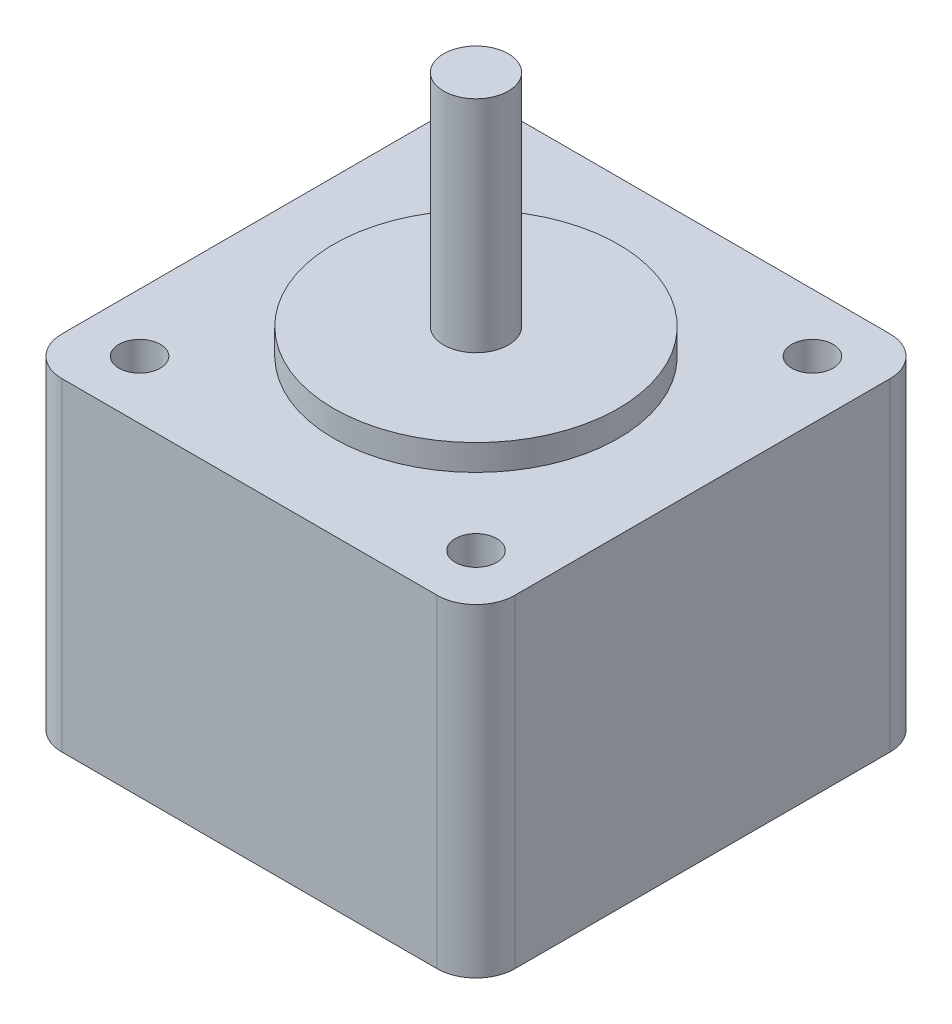
ISO-10303-21;
HEADER;
FILE_DESCRIPTION(('STEP AP214'),'2;1');
FILE_NAME('part.step','',(''),(''),'','','');
FILE_SCHEMA(('AUTOMOTIVE_DESIGN { 1 0 10303 214 1 1 1 1 }'));
ENDSEC;
DATA;
#1=APPLICATION_CONTEXT('core data for automotive mechanical design processes');
#2=APPLICATION_PROTOCOL_DEFINITION('international standard','automotive_design',2000,#1);
#3=PRODUCT_CONTEXT('',#1,'mechanical');
#4=PRODUCT('Part','Part','',(#3));
#5=PRODUCT_RELATED_PRODUCT_CATEGORY('part','',(#4));
#6=PRODUCT_DEFINITION_FORMATION('','',#4);
#7=PRODUCT_DEFINITION_CONTEXT('part definition',#1,'design');
#8=PRODUCT_DEFINITION('design','',#6,#7);
#9=PRODUCT_DEFINITION_SHAPE('','',#8);
#10=(LENGTH_UNIT() NAMED_UNIT(*) SI_UNIT(.MILLI.,.METRE.));
#11=(NAMED_UNIT(*) PLANE_ANGLE_UNIT() SI_UNIT($,.RADIAN.));
#12=(NAMED_UNIT(*) SI_UNIT($,.STERADIAN.) SOLID_ANGLE_UNIT());
#13=UNCERTAINTY_MEASURE_WITH_UNIT(LENGTH_MEASURE(1.E-05),#10,'distance_accuracy_value','');
#14=(GEOMETRIC_REPRESENTATION_CONTEXT(3) GLOBAL_UNCERTAINTY_ASSIGNED_CONTEXT((#13)) GLOBAL_UNIT_ASSIGNED_CONTEXT((#10,
#11,#12)) REPRESENTATION_CONTEXT('',''));
#15=CARTESIAN_POINT('',(0.,0.,0.));
#16=DIRECTION('',(0.,0.,1.));
#17=DIRECTION('',(1.,0.,0.));
#18=AXIS2_PLACEMENT_3D('',#15,#16,#17);
#19=CARTESIAN_POINT('',(-14.5,25.,14.5));
#20=DIRECTION('',(0.,-1.,0.));
#21=DIRECTION('',(0.,0.,-1.));
#22=AXIS2_PLACEMENT_3D('',#19,#20,#21);
#23=CYLINDRICAL_SURFACE('',#22,3.);
#24=CARTESIAN_POINT('',(-14.5,0.,14.5));
#25=DIRECTION('',(0.,1.,0.));
#26=DIRECTION('',(0.,0.,1.));
#27=AXIS2_PLACEMENT_3D('',#24,#25,#26);
#28=CIRCLE('',#27,3.);
#29=CARTESIAN_POINT('',(-17.5,0.,14.5));
#30=VERTEX_POINT('',#29);
#31=CARTESIAN_POINT('',(-14.5,0.,17.5));
#32=VERTEX_POINT('',#31);
#33=EDGE_CURVE('E143',#30,#32,#28,.T.);
#34=ORIENTED_EDGE('',*,*,#33,.T.);
#35=DIRECTION('',(0.,-1.,0.));
#36=VECTOR('',#35,1.);
#37=CARTESIAN_POINT('',(-14.5,25.,17.5));
#38=LINE('',#37,#36);
#39=CARTESIAN_POINT('',(-14.5,25.,17.5));
#40=VERTEX_POINT('',#39);
#41=EDGE_CURVE('E42',#40,#32,#38,.T.);
#42=ORIENTED_EDGE('',*,*,#41,.F.);
#43=CARTESIAN_POINT('',(-14.5,25.,14.5));
#44=DIRECTION('',(0.,1.,0.));
#45=DIRECTION('',(0.,0.,1.));
#46=AXIS2_PLACEMENT_3D('',#43,#44,#45);
#47=CIRCLE('',#46,3.);
#48=CARTESIAN_POINT('',(-17.5,25.,14.5));
#49=VERTEX_POINT('',#48);
#50=EDGE_CURVE('E166',#49,#40,#47,.T.);
#51=ORIENTED_EDGE('',*,*,#50,.F.);
#52=DIRECTION('',(0.,-1.,0.));
#53=VECTOR('',#52,1.);
#54=CARTESIAN_POINT('',(-17.5,25.,14.5));
#55=LINE('',#54,#53);
#56=EDGE_CURVE('E139',#49,#30,#55,.T.);
#57=ORIENTED_EDGE('',*,*,#56,.T.);
#58=EDGE_LOOP('',(#34,#42,#51,#57));
#59=FACE_BOUND('',#58,.T.);
#60=ADVANCED_FACE('F39',(#59),#23,.T.);
#61=CARTESIAN_POINT('',(-14.5,25.,17.5));
#62=DIRECTION('',(0.,0.,-1.));
#63=DIRECTION('',(-1.,0.,0.));
#64=AXIS2_PLACEMENT_3D('',#61,#62,#63);
#65=PLANE('',#64);
#66=DIRECTION('',(1.,0.,0.));
#67=VECTOR('',#66,1.);
#68=CARTESIAN_POINT('',(-14.5,0.,17.5));
#69=LINE('',#68,#67);
#70=CARTESIAN_POINT('',(14.5,0.,17.5));
#71=VERTEX_POINT('',#70);
#72=EDGE_CURVE('E147',#32,#71,#69,.T.);
#73=ORIENTED_EDGE('',*,*,#72,.T.);
#74=DIRECTION('',(0.,-1.,0.));
#75=VECTOR('',#74,1.);
#76=CARTESIAN_POINT('',(14.5,25.,17.5));
#77=LINE('',#76,#75);
#78=CARTESIAN_POINT('',(14.5,25.,17.5));
#79=VERTEX_POINT('',#78);
#80=EDGE_CURVE('E180',#79,#71,#77,.T.);
#81=ORIENTED_EDGE('',*,*,#80,.F.);
#82=DIRECTION('',(1.,0.,0.));
#83=VECTOR('',#82,1.);
#84=CARTESIAN_POINT('',(-14.5,25.,17.5));
#85=LINE('',#84,#83);
#86=EDGE_CURVE('E102',#40,#79,#85,.T.);
#87=ORIENTED_EDGE('',*,*,#86,.F.);
#88=ORIENTED_EDGE('',*,*,#41,.T.);
#89=EDGE_LOOP('',(#73,#81,#87,#88));
#90=FACE_BOUND('',#89,.T.);
#91=ADVANCED_FACE('F277',(#90),#65,.F.);
#92=CARTESIAN_POINT('',(14.5,25.,14.5));
#93=DIRECTION('',(0.,-1.,0.));
#94=DIRECTION('',(0.,0.,-1.));
#95=AXIS2_PLACEMENT_3D('',#92,#93,#94);
#96=CYLINDRICAL_SURFACE('',#95,3.);
#97=CARTESIAN_POINT('',(14.5,0.,14.5));
#98=DIRECTION('',(0.,1.,0.));
#99=DIRECTION('',(0.,0.,1.));
#100=AXIS2_PLACEMENT_3D('',#97,#98,#99);
#101=CIRCLE('',#100,3.);
#102=CARTESIAN_POINT('',(17.5,0.,14.5));
#103=VERTEX_POINT('',#102);
#104=EDGE_CURVE('E151',#71,#103,#101,.T.);
#105=ORIENTED_EDGE('',*,*,#104,.T.);
#106=DIRECTION('',(0.,-1.,0.));
#107=VECTOR('',#106,1.);
#108=CARTESIAN_POINT('',(17.5,25.,14.5));
#109=LINE('',#108,#107);
#110=CARTESIAN_POINT('',(17.5,25.,14.5));
#111=VERTEX_POINT('',#110);
#112=EDGE_CURVE('E177',#111,#103,#109,.T.);
#113=ORIENTED_EDGE('',*,*,#112,.F.);
#114=CARTESIAN_POINT('',(14.5,25.,14.5));
#115=DIRECTION('',(0.,1.,0.));
#116=DIRECTION('',(0.,0.,1.));
#117=AXIS2_PLACEMENT_3D('',#114,#115,#116);
#118=CIRCLE('',#117,3.);
#119=EDGE_CURVE('E199',#79,#111,#118,.T.);
#120=ORIENTED_EDGE('',*,*,#119,.F.);
#121=ORIENTED_EDGE('',*,*,#80,.T.);
#122=EDGE_LOOP('',(#105,#113,#120,#121));
#123=FACE_BOUND('',#122,.T.);
#124=ADVANCED_FACE('F282',(#123),#96,.T.);
#125=CARTESIAN_POINT('',(17.5,25.,-14.5));
#126=DIRECTION('',(-1.,0.,0.));
#127=DIRECTION('',(0.,0.,1.));
#128=AXIS2_PLACEMENT_3D('',#125,#126,#127);
#129=PLANE('',#128);
#130=DIRECTION('',(0.,0.,-1.));
#131=VECTOR('',#130,1.);
#132=CARTESIAN_POINT('',(17.5,0.,-14.5));
#133=LINE('',#132,#131);
#134=CARTESIAN_POINT('',(17.5,0.,-14.5));
#135=VERTEX_POINT('',#134);
#136=EDGE_CURVE('E154',#103,#135,#133,.T.);
#137=ORIENTED_EDGE('',*,*,#136,.T.);
#138=DIRECTION('',(0.,-1.,0.));
#139=VECTOR('',#138,1.);
#140=CARTESIAN_POINT('',(17.5,25.,-14.5));
#141=LINE('',#140,#139);
#142=CARTESIAN_POINT('',(17.5,25.,-14.5));
#143=VERTEX_POINT('',#142);
#144=EDGE_CURVE('E173',#143,#135,#141,.T.);
#145=ORIENTED_EDGE('',*,*,#144,.F.);
#146=DIRECTION('',(0.,0.,-1.));
#147=VECTOR('',#146,1.);
#148=CARTESIAN_POINT('',(17.5,25.,-14.5));
#149=LINE('',#148,#147);
#150=EDGE_CURVE('E202',#111,#143,#149,.T.);
#151=ORIENTED_EDGE('',*,*,#150,.F.);
#152=ORIENTED_EDGE('',*,*,#112,.T.);
#153=EDGE_LOOP('',(#137,#145,#151,#152));
#154=FACE_BOUND('',#153,.T.);
#155=ADVANCED_FACE('F291',(#154),#129,.F.);
#156=CARTESIAN_POINT('',(14.5,25.,-14.5));
#157=DIRECTION('',(0.,-1.,0.));
#158=DIRECTION('',(0.,0.,-1.));
#159=AXIS2_PLACEMENT_3D('',#156,#157,#158);
#160=CYLINDRICAL_SURFACE('',#159,3.);
#161=CARTESIAN_POINT('',(14.5,0.,-14.5));
#162=DIRECTION('',(0.,1.,0.));
#163=DIRECTION('',(0.,0.,1.));
#164=AXIS2_PLACEMENT_3D('',#161,#162,#163);
#165=CIRCLE('',#164,3.);
#166=CARTESIAN_POINT('',(14.5,0.,-17.5));
#167=VERTEX_POINT('',#166);
#168=EDGE_CURVE('E157',#135,#167,#165,.T.);
#169=ORIENTED_EDGE('',*,*,#168,.T.);
#170=DIRECTION('',(0.,-1.,0.));
#171=VECTOR('',#170,1.);
#172=CARTESIAN_POINT('',(14.5,25.,-17.5));
#173=LINE('',#172,#171);
#174=CARTESIAN_POINT('',(14.5,25.,-17.5));
#175=VERTEX_POINT('',#174);
#176=EDGE_CURVE('E132',#175,#167,#173,.T.);
#177=ORIENTED_EDGE('',*,*,#176,.F.);
#178=CARTESIAN_POINT('',(14.5,25.,-14.5));
#179=DIRECTION('',(0.,1.,0.));
#180=DIRECTION('',(0.,0.,1.));
#181=AXIS2_PLACEMENT_3D('',#178,#179,#180);
#182=CIRCLE('',#181,3.);
#183=EDGE_CURVE('E121',#143,#175,#182,.T.);
#184=ORIENTED_EDGE('',*,*,#183,.F.);
#185=ORIENTED_EDGE('',*,*,#144,.T.);
#186=EDGE_LOOP('',(#169,#177,#184,#185));
#187=FACE_BOUND('',#186,.T.);
#188=ADVANCED_FACE('F294',(#187),#160,.T.);
#189=CARTESIAN_POINT('',(-14.5,25.,-17.5));
#190=DIRECTION('',(0.,0.,1.));
#191=DIRECTION('',(1.,0.,0.));
#192=AXIS2_PLACEMENT_3D('',#189,#190,#191);
#193=PLANE('',#192);
#194=DIRECTION('',(-1.,0.,0.));
#195=VECTOR('',#194,1.);
#196=CARTESIAN_POINT('',(-14.5,0.,-17.5));
#197=LINE('',#196,#195);
#198=CARTESIAN_POINT('',(-14.5,0.,-17.5));
#199=VERTEX_POINT('',#198);
#200=EDGE_CURVE('E130',#167,#199,#197,.T.);
#201=ORIENTED_EDGE('',*,*,#200,.T.);
#202=DIRECTION('',(0.,-1.,0.));
#203=VECTOR('',#202,1.);
#204=CARTESIAN_POINT('',(-14.5,25.,-17.5));
#205=LINE('',#204,#203);
#206=CARTESIAN_POINT('',(-14.5,25.,-17.5));
#207=VERTEX_POINT('',#206);
#208=EDGE_CURVE('E127',#207,#199,#205,.T.);
#209=ORIENTED_EDGE('',*,*,#208,.F.);
#210=DIRECTION('',(-1.,0.,0.));
#211=VECTOR('',#210,1.);
#212=CARTESIAN_POINT('',(-14.5,25.,-17.5));
#213=LINE('',#212,#211);
#214=EDGE_CURVE('E115',#175,#207,#213,.T.);
#215=ORIENTED_EDGE('',*,*,#214,.F.);
#216=ORIENTED_EDGE('',*,*,#176,.T.);
#217=EDGE_LOOP('',(#201,#209,#215,#216));
#218=FACE_BOUND('',#217,.T.);
#219=ADVANCED_FACE('F128',(#218),#193,.F.);
#220=CARTESIAN_POINT('',(-14.5,25.,-14.5));
#221=DIRECTION('',(0.,-1.,0.));
#222=DIRECTION('',(0.,0.,-1.));
#223=AXIS2_PLACEMENT_3D('',#220,#221,#222);
#224=CYLINDRICAL_SURFACE('',#223,3.);
#225=CARTESIAN_POINT('',(-14.5,0.,-14.5));
#226=DIRECTION('',(0.,1.,0.));
#227=DIRECTION('',(0.,0.,-1.));
#228=AXIS2_PLACEMENT_3D('',#225,#226,#227);
#229=CIRCLE('',#228,3.);
#230=CARTESIAN_POINT('',(-17.5,0.,-14.5));
#231=VERTEX_POINT('',#230);
#232=EDGE_CURVE('E87',#199,#231,#229,.T.);
#233=ORIENTED_EDGE('',*,*,#232,.T.);
#234=DIRECTION('',(0.,-1.,0.));
#235=VECTOR('',#234,1.);
#236=CARTESIAN_POINT('',(-17.5,25.,-14.5));
#237=LINE('',#236,#235);
#238=CARTESIAN_POINT('',(-17.5,25.,-14.5));
#239=VERTEX_POINT('',#238);
#240=EDGE_CURVE('E133',#239,#231,#237,.T.);
#241=ORIENTED_EDGE('',*,*,#240,.F.);
#242=CARTESIAN_POINT('',(-14.5,25.,-14.5));
#243=DIRECTION('',(0.,1.,0.));
#244=DIRECTION('',(0.,0.,-1.));
#245=AXIS2_PLACEMENT_3D('',#242,#243,#244);
#246=CIRCLE('',#245,3.);
#247=EDGE_CURVE('E119',#207,#239,#246,.T.);
#248=ORIENTED_EDGE('',*,*,#247,.F.);
#249=ORIENTED_EDGE('',*,*,#208,.T.);
#250=EDGE_LOOP('',(#233,#241,#248,#249));
#251=FACE_BOUND('',#250,.T.);
#252=ADVANCED_FACE('F135',(#251),#224,.T.);
#253=CARTESIAN_POINT('',(-17.5,25.,-14.5));
#254=DIRECTION('',(1.,0.,0.));
#255=DIRECTION('',(0.,0.,-1.));
#256=AXIS2_PLACEMENT_3D('',#253,#254,#255);
#257=PLANE('',#256);
#258=DIRECTION('',(0.,0.,1.));
#259=VECTOR('',#258,1.);
#260=CARTESIAN_POINT('',(-17.5,0.,-14.5));
#261=LINE('',#260,#259);
#262=EDGE_CURVE('E93',#231,#30,#261,.T.);
#263=ORIENTED_EDGE('',*,*,#262,.T.);
#264=ORIENTED_EDGE('',*,*,#56,.F.);
#265=DIRECTION('',(0.,0.,1.));
#266=VECTOR('',#265,1.);
#267=CARTESIAN_POINT('',(-17.5,25.,-14.5));
#268=LINE('',#267,#266);
#269=EDGE_CURVE('E58',#239,#49,#268,.T.);
#270=ORIENTED_EDGE('',*,*,#269,.F.);
#271=ORIENTED_EDGE('',*,*,#240,.T.);
#272=EDGE_LOOP('',(#263,#264,#270,#271));
#273=FACE_BOUND('',#272,.T.);
#274=ADVANCED_FACE('F250',(#273),#257,.F.);
#275=CARTESIAN_POINT('',(-14.5,25.,14.5));
#276=DIRECTION('',(0.,1.,0.));
#277=DIRECTION('',(0.,0.,1.));
#278=AXIS2_PLACEMENT_3D('',#275,#276,#277);
#279=PLANE('',#278);
#280=CARTESIAN_POINT('',(-13.,25.,13.));
#281=DIRECTION('',(0.,1.,0.));
#282=DIRECTION('',(0.,0.,1.));
#283=AXIS2_PLACEMENT_3D('',#280,#281,#282);
#284=CIRCLE('',#283,1.6);
#285=CARTESIAN_POINT('',(-13.,25.,14.6));
#286=VERTEX_POINT('',#285);
#287=EDGE_CURVE('E239',#286,#286,#284,.T.);
#288=ORIENTED_EDGE('',*,*,#287,.F.);
#289=EDGE_LOOP('',(#288));
#290=FACE_BOUND('',#289,.T.);
#291=CARTESIAN_POINT('',(13.,25.,13.));
#292=DIRECTION('',(0.,1.,0.));
#293=DIRECTION('',(0.,0.,1.));
#294=AXIS2_PLACEMENT_3D('',#291,#292,#293);
#295=CIRCLE('',#294,1.6);
#296=CARTESIAN_POINT('',(13.,25.,14.6));
#297=VERTEX_POINT('',#296);
#298=EDGE_CURVE('E231',#297,#297,#295,.T.);
#299=ORIENTED_EDGE('',*,*,#298,.F.);
#300=EDGE_LOOP('',(#299));
#301=FACE_BOUND('',#300,.T.);
#302=CARTESIAN_POINT('',(13.,25.,-13.));
#303=DIRECTION('',(0.,1.,0.));
#304=DIRECTION('',(0.,0.,1.));
#305=AXIS2_PLACEMENT_3D('',#302,#303,#304);
#306=CIRCLE('',#305,1.6);
#307=CARTESIAN_POINT('',(13.,25.,-11.4));
#308=VERTEX_POINT('',#307);
#309=EDGE_CURVE('E223',#308,#308,#306,.T.);
#310=ORIENTED_EDGE('',*,*,#309,.F.);
#311=EDGE_LOOP('',(#310));
#312=FACE_BOUND('',#311,.T.);
#313=CARTESIAN_POINT('',(-13.,25.,-13.));
#314=DIRECTION('',(0.,1.,0.));
#315=DIRECTION('',(0.,0.,1.));
#316=AXIS2_PLACEMENT_3D('',#313,#314,#315);
#317=CIRCLE('',#316,1.6);
#318=CARTESIAN_POINT('',(-13.,25.,-11.4));
#319=VERTEX_POINT('',#318);
#320=EDGE_CURVE('E215',#319,#319,#317,.T.);
#321=ORIENTED_EDGE('',*,*,#320,.F.);
#322=EDGE_LOOP('',(#321));
#323=FACE_BOUND('',#322,.T.);
#324=CARTESIAN_POINT('',(0.,25.,0.));
#325=DIRECTION('',(0.,1.,0.));
#326=DIRECTION('',(0.,0.,1.));
#327=AXIS2_PLACEMENT_3D('',#324,#325,#326);
#328=CIRCLE('',#327,11.);
#329=CARTESIAN_POINT('',(0.,25.,11.));
#330=VERTEX_POINT('',#329);
#331=EDGE_CURVE('E49',#330,#330,#328,.T.);
#332=ORIENTED_EDGE('',*,*,#331,.F.);
#333=EDGE_LOOP('',(#332));
#334=FACE_BOUND('',#333,.T.);
#335=ORIENTED_EDGE('',*,*,#50,.T.);
#336=ORIENTED_EDGE('',*,*,#86,.T.);
#337=ORIENTED_EDGE('',*,*,#119,.T.);
#338=ORIENTED_EDGE('',*,*,#150,.T.);
#339=ORIENTED_EDGE('',*,*,#183,.T.);
#340=ORIENTED_EDGE('',*,*,#214,.T.);
#341=ORIENTED_EDGE('',*,*,#247,.T.);
#342=ORIENTED_EDGE('',*,*,#269,.T.);
#343=EDGE_LOOP('',(#335,#336,#337,#338,#339,#340,#341,#342));
#344=FACE_BOUND('',#343,.T.);
#345=ADVANCED_FACE('F117',(#290,#301,#312,#323,#334,#344),#279,.T.);
#346=CARTESIAN_POINT('',(-14.5,0.,14.5));
#347=DIRECTION('',(0.,1.,0.));
#348=DIRECTION('',(0.,0.,1.));
#349=AXIS2_PLACEMENT_3D('',#346,#347,#348);
#350=PLANE('',#349);
#351=ORIENTED_EDGE('',*,*,#33,.F.);
#352=ORIENTED_EDGE('',*,*,#262,.F.);
#353=ORIENTED_EDGE('',*,*,#232,.F.);
#354=ORIENTED_EDGE('',*,*,#200,.F.);
#355=ORIENTED_EDGE('',*,*,#168,.F.);
#356=ORIENTED_EDGE('',*,*,#136,.F.);
#357=ORIENTED_EDGE('',*,*,#104,.F.);
#358=ORIENTED_EDGE('',*,*,#72,.F.);
#359=EDGE_LOOP('',(#351,#352,#353,#354,#355,#356,#357,#358));
#360=FACE_BOUND('',#359,.T.);
#361=ADVANCED_FACE('F249',(#360),#350,.F.);
#362=CARTESIAN_POINT('',(0.,27.,0.));
#363=DIRECTION('',(0.,-1.,0.));
#364=DIRECTION('',(0.,0.,-1.));
#365=AXIS2_PLACEMENT_3D('',#362,#363,#364);
#366=CYLINDRICAL_SURFACE('',#365,11.);
#367=CARTESIAN_POINT('',(0.,27.,0.));
#368=DIRECTION('',(0.,1.,0.));
#369=DIRECTION('',(0.,0.,1.));
#370=AXIS2_PLACEMENT_3D('',#367,#368,#369);
#371=CIRCLE('',#370,11.);
#372=CARTESIAN_POINT('',(0.,27.,11.));
#373=VERTEX_POINT('',#372);
#374=EDGE_CURVE('E148',#373,#373,#371,.T.);
#375=ORIENTED_EDGE('',*,*,#374,.F.);
#376=EDGE_LOOP('',(#375));
#377=FACE_BOUND('',#376,.T.);
#378=ORIENTED_EDGE('',*,*,#331,.T.);
#379=EDGE_LOOP('',(#378));
#380=FACE_BOUND('',#379,.T.);
#381=ADVANCED_FACE('F349',(#377,#380),#366,.T.);
#382=CARTESIAN_POINT('',(0.,27.,0.));
#383=DIRECTION('',(0.,1.,0.));
#384=DIRECTION('',(0.,0.,1.));
#385=AXIS2_PLACEMENT_3D('',#382,#383,#384);
#386=PLANE('',#385);
#387=CARTESIAN_POINT('',(0.,27.,0.));
#388=DIRECTION('',(0.,1.,0.));
#389=DIRECTION('',(0.,0.,1.));
#390=AXIS2_PLACEMENT_3D('',#387,#388,#389);
#391=CIRCLE('',#390,2.5);
#392=CARTESIAN_POINT('',(0.,27.,2.5));
#393=VERTEX_POINT('',#392);
#394=EDGE_CURVE('E11',#393,#393,#391,.T.);
#395=ORIENTED_EDGE('',*,*,#394,.F.);
#396=EDGE_LOOP('',(#395));
#397=FACE_BOUND('',#396,.T.);
#398=ORIENTED_EDGE('',*,*,#374,.T.);
#399=EDGE_LOOP('',(#398));
#400=FACE_BOUND('',#399,.T.);
#401=ADVANCED_FACE('F358',(#397,#400),#386,.T.);
#402=CARTESIAN_POINT('',(0.,44.,0.));
#403=DIRECTION('',(0.,-1.,0.));
#404=DIRECTION('',(0.,0.,-1.));
#405=AXIS2_PLACEMENT_3D('',#402,#403,#404);
#406=CYLINDRICAL_SURFACE('',#405,2.5);
#407=CARTESIAN_POINT('',(0.,44.,0.));
#408=DIRECTION('',(0.,1.,0.));
#409=DIRECTION('',(0.,0.,1.));
#410=AXIS2_PLACEMENT_3D('',#407,#408,#409);
#411=CIRCLE('',#410,2.5);
#412=CARTESIAN_POINT('',(0.,44.,2.5));
#413=VERTEX_POINT('',#412);
#414=EDGE_CURVE('E208',#413,#413,#411,.T.);
#415=ORIENTED_EDGE('',*,*,#414,.F.);
#416=EDGE_LOOP('',(#415));
#417=FACE_BOUND('',#416,.T.);
#418=ORIENTED_EDGE('',*,*,#394,.T.);
#419=EDGE_LOOP('',(#418));
#420=FACE_BOUND('',#419,.T.);
#421=ADVANCED_FACE('F272',(#417,#420),#406,.T.);
#422=CARTESIAN_POINT('',(0.,44.,0.));
#423=DIRECTION('',(0.,1.,0.));
#424=DIRECTION('',(0.,0.,1.));
#425=AXIS2_PLACEMENT_3D('',#422,#423,#424);
#426=PLANE('',#425);
#427=ORIENTED_EDGE('',*,*,#414,.T.);
#428=EDGE_LOOP('',(#427));
#429=FACE_BOUND('',#428,.T.);
#430=ADVANCED_FACE('F262',(#429),#426,.T.);
#431=CARTESIAN_POINT('',(-13.,20.,-13.));
#432=DIRECTION('',(0.,1.,0.));
#433=DIRECTION('',(0.,0.,1.));
#434=AXIS2_PLACEMENT_3D('',#431,#432,#433);
#435=CYLINDRICAL_SURFACE('',#434,1.6);
#436=CARTESIAN_POINT('',(-13.,20.,-13.));
#437=DIRECTION('',(0.,1.,0.));
#438=DIRECTION('',(0.,0.,1.));
#439=AXIS2_PLACEMENT_3D('',#436,#437,#438);
#440=CIRCLE('',#439,1.6);
#441=CARTESIAN_POINT('',(-13.,20.,-11.4));
#442=VERTEX_POINT('',#441);
#443=EDGE_CURVE('E211',#442,#442,#440,.T.);
#444=ORIENTED_EDGE('',*,*,#443,.F.);
#445=EDGE_LOOP('',(#444));
#446=FACE_BOUND('',#445,.T.);
#447=ORIENTED_EDGE('',*,*,#320,.T.);
#448=EDGE_LOOP('',(#447));
#449=FACE_BOUND('',#448,.T.);
#450=ADVANCED_FACE('F259',(#446,#449),#435,.F.);
#451=CARTESIAN_POINT('',(-13.,20.,-13.));
#452=DIRECTION('',(0.,1.,0.));
#453=DIRECTION('',(0.,0.,1.));
#454=AXIS2_PLACEMENT_3D('',#451,#452,#453);
#455=PLANE('',#454);
#456=ORIENTED_EDGE('',*,*,#443,.T.);
#457=EDGE_LOOP('',(#456));
#458=FACE_BOUND('',#457,.T.);
#459=ADVANCED_FACE('F261',(#458),#455,.T.);
#460=CARTESIAN_POINT('',(13.,20.,-13.));
#461=DIRECTION('',(0.,1.,0.));
#462=DIRECTION('',(0.,0.,1.));
#463=AXIS2_PLACEMENT_3D('',#460,#461,#462);
#464=CYLINDRICAL_SURFACE('',#463,1.6);
#465=CARTESIAN_POINT('',(13.,20.,-13.));
#466=DIRECTION('',(0.,1.,0.));
#467=DIRECTION('',(0.,0.,1.));
#468=AXIS2_PLACEMENT_3D('',#465,#466,#467);
#469=CIRCLE('',#468,1.6);
#470=CARTESIAN_POINT('',(13.,20.,-11.4));
#471=VERTEX_POINT('',#470);
#472=EDGE_CURVE('E219',#471,#471,#469,.T.);
#473=ORIENTED_EDGE('',*,*,#472,.F.);
#474=EDGE_LOOP('',(#473));
#475=FACE_BOUND('',#474,.T.);
#476=ORIENTED_EDGE('',*,*,#309,.T.);
#477=EDGE_LOOP('',(#476));
#478=FACE_BOUND('',#477,.T.);
#479=ADVANCED_FACE('F269',(#475,#478),#464,.F.);
#480=CARTESIAN_POINT('',(13.,20.,-13.));
#481=DIRECTION('',(0.,1.,0.));
#482=DIRECTION('',(0.,0.,1.));
#483=AXIS2_PLACEMENT_3D('',#480,#481,#482);
#484=PLANE('',#483);
#485=ORIENTED_EDGE('',*,*,#472,.T.);
#486=EDGE_LOOP('',(#485));
#487=FACE_BOUND('',#486,.T.);
#488=ADVANCED_FACE('F407',(#487),#484,.T.);
#489=CARTESIAN_POINT('',(13.,20.,13.));
#490=DIRECTION('',(0.,1.,0.));
#491=DIRECTION('',(0.,0.,1.));
#492=AXIS2_PLACEMENT_3D('',#489,#490,#491);
#493=CYLINDRICAL_SURFACE('',#492,1.6);
#494=CARTESIAN_POINT('',(13.,20.,13.));
#495=DIRECTION('',(0.,1.,0.));
#496=DIRECTION('',(0.,0.,1.));
#497=AXIS2_PLACEMENT_3D('',#494,#495,#496);
#498=CIRCLE('',#497,1.6);
#499=CARTESIAN_POINT('',(13.,20.,14.6));
#500=VERTEX_POINT('',#499);
#501=EDGE_CURVE('E227',#500,#500,#498,.T.);
#502=ORIENTED_EDGE('',*,*,#501,.F.);
#503=EDGE_LOOP('',(#502));
#504=FACE_BOUND('',#503,.T.);
#505=ORIENTED_EDGE('',*,*,#298,.T.);
#506=EDGE_LOOP('',(#505));
#507=FACE_BOUND('',#506,.T.);
#508=ADVANCED_FACE('F417',(#504,#507),#493,.F.);
#509=CARTESIAN_POINT('',(13.,20.,13.));
#510=DIRECTION('',(0.,1.,0.));
#511=DIRECTION('',(0.,0.,1.));
#512=AXIS2_PLACEMENT_3D('',#509,#510,#511);
#513=PLANE('',#512);
#514=ORIENTED_EDGE('',*,*,#501,.T.);
#515=EDGE_LOOP('',(#514));
#516=FACE_BOUND('',#515,.T.);
#517=ADVANCED_FACE('F427',(#516),#513,.T.);
#518=CARTESIAN_POINT('',(-13.,20.,13.));
#519=DIRECTION('',(0.,1.,0.));
#520=DIRECTION('',(0.,0.,1.));
#521=AXIS2_PLACEMENT_3D('',#518,#519,#520);
#522=CYLINDRICAL_SURFACE('',#521,1.6);
#523=CARTESIAN_POINT('',(-13.,20.,13.));
#524=DIRECTION('',(0.,1.,0.));
#525=DIRECTION('',(0.,0.,1.));
#526=AXIS2_PLACEMENT_3D('',#523,#524,#525);
#527=CIRCLE('',#526,1.6);
#528=CARTESIAN_POINT('',(-13.,20.,14.6));
#529=VERTEX_POINT('',#528);
#530=EDGE_CURVE('E235',#529,#529,#527,.T.);
#531=ORIENTED_EDGE('',*,*,#530,.F.);
#532=EDGE_LOOP('',(#531));
#533=FACE_BOUND('',#532,.T.);
#534=ORIENTED_EDGE('',*,*,#287,.T.);
#535=EDGE_LOOP('',(#534));
#536=FACE_BOUND('',#535,.T.);
#537=ADVANCED_FACE('F245',(#533,#536),#522,.F.);
#538=CARTESIAN_POINT('',(-13.,20.,13.));
#539=DIRECTION('',(0.,1.,0.));
#540=DIRECTION('',(0.,0.,1.));
#541=AXIS2_PLACEMENT_3D('',#538,#539,#540);
#542=PLANE('',#541);
#543=ORIENTED_EDGE('',*,*,#530,.T.);
#544=EDGE_LOOP('',(#543));
#545=FACE_BOUND('',#544,.T.);
#546=ADVANCED_FACE('F446',(#545),#542,.T.);
#547=CLOSED_SHELL('',(#60,#91,#124,#155,#188,#219,#252,#274,#345,#361,#381,#401,#421,#430,#450,
#459,#479,#488,#508,#517,#537,#546));
#548=MANIFOLD_SOLID_BREP('B2',#547);
#549=ADVANCED_BREP_SHAPE_REPRESENTATION('',(#18,#548),#14);
#550=SHAPE_DEFINITION_REPRESENTATION(#9,#549);
ENDSEC;
END-ISO-10303-21;
